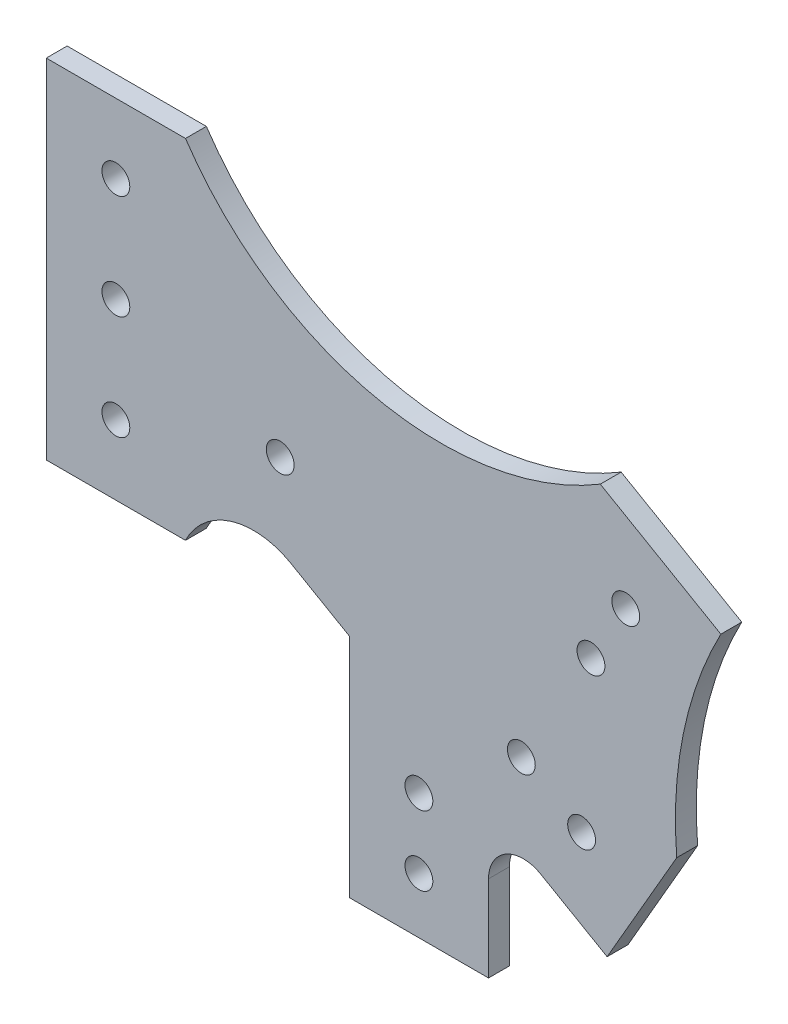
ISO-10303-21;
HEADER;
FILE_DESCRIPTION(('STEP AP214'),'2;1');
FILE_NAME('part.step','',(''),(''),'','','');
FILE_SCHEMA(('AUTOMOTIVE_DESIGN { 1 0 10303 214 1 1 1 1 }'));
ENDSEC;
DATA;
#1=APPLICATION_CONTEXT('core data for automotive mechanical design processes');
#2=APPLICATION_PROTOCOL_DEFINITION('international standard','automotive_design',2000,#1);
#3=PRODUCT_CONTEXT('',#1,'mechanical');
#4=PRODUCT('Part','Part','',(#3));
#5=PRODUCT_RELATED_PRODUCT_CATEGORY('part','',(#4));
#6=PRODUCT_DEFINITION_FORMATION('','',#4);
#7=PRODUCT_DEFINITION_CONTEXT('part definition',#1,'design');
#8=PRODUCT_DEFINITION('design','',#6,#7);
#9=PRODUCT_DEFINITION_SHAPE('','',#8);
#10=(LENGTH_UNIT() NAMED_UNIT(*) SI_UNIT(.MILLI.,.METRE.));
#11=(NAMED_UNIT(*) PLANE_ANGLE_UNIT() SI_UNIT($,.RADIAN.));
#12=(NAMED_UNIT(*) SI_UNIT($,.STERADIAN.) SOLID_ANGLE_UNIT());
#13=UNCERTAINTY_MEASURE_WITH_UNIT(LENGTH_MEASURE(1.E-05),#10,'distance_accuracy_value','');
#14=(GEOMETRIC_REPRESENTATION_CONTEXT(3) GLOBAL_UNCERTAINTY_ASSIGNED_CONTEXT((#13)) GLOBAL_UNIT_ASSIGNED_CONTEXT((#10,
#11,#12)) REPRESENTATION_CONTEXT('',''));
#15=CARTESIAN_POINT('',(0.,0.,0.));
#16=DIRECTION('',(0.,0.,1.));
#17=DIRECTION('',(1.,0.,0.));
#18=AXIS2_PLACEMENT_3D('',#15,#16,#17);
#19=CARTESIAN_POINT('',(97.8921935759024,-16.1788863713417,3.));
#20=DIRECTION('',(0.,0.,1.));
#21=DIRECTION('',(1.,0.,0.));
#22=AXIS2_PLACEMENT_3D('',#19,#20,#21);
#23=PLANE('',#22);
#24=CARTESIAN_POINT('',(4.60803954377895,-31.2923299826771,3.));
#25=DIRECTION('',(0.,0.,1.));
#26=DIRECTION('',(1.,0.,0.));
#27=AXIS2_PLACEMENT_3D('',#24,#25,#26);
#28=CIRCLE('',#27,1.99999999999997);
#29=CARTESIAN_POINT('',(6.60803954377892,-31.2923299826771,3.));
#30=VERTEX_POINT('',#29);
#31=EDGE_CURVE('E394',#30,#30,#28,.T.);
#32=ORIENTED_EDGE('',*,*,#31,.F.);
#33=EDGE_LOOP('',(#32));
#34=FACE_BOUND('',#33,.T.);
#35=CARTESIAN_POINT('',(19.3236286488305,-19.4678712380731,3.));
#36=DIRECTION('',(0.,0.,1.));
#37=DIRECTION('',(1.,0.,0.));
#38=AXIS2_PLACEMENT_3D('',#35,#36,#37);
#39=CIRCLE('',#38,2.);
#40=CARTESIAN_POINT('',(21.3236286488305,-19.4678712380731,3.));
#41=VERTEX_POINT('',#40);
#42=EDGE_CURVE('E410',#41,#41,#39,.T.);
#43=ORIENTED_EDGE('',*,*,#42,.F.);
#44=EDGE_LOOP('',(#43));
#45=FACE_BOUND('',#44,.T.);
#46=CARTESIAN_POINT('',(34.3236286488309,6.51289087545992,3.));
#47=DIRECTION('',(0.,0.,1.));
#48=DIRECTION('',(1.,0.,0.));
#49=AXIS2_PLACEMENT_3D('',#46,#47,#48);
#50=CIRCLE('',#49,2.);
#51=CARTESIAN_POINT('',(36.3236286488309,6.51289087545992,3.));
#52=VERTEX_POINT('',#51);
#53=EDGE_CURVE('E426',#52,#52,#50,.T.);
#54=ORIENTED_EDGE('',*,*,#53,.F.);
#55=EDGE_LOOP('',(#54));
#56=FACE_BOUND('',#55,.T.);
#57=CARTESIAN_POINT('',(-38.9219604562211,-6.61326738106016,3.));
#58=DIRECTION('',(0.,0.,1.));
#59=DIRECTION('',(1.,0.,0.));
#60=AXIS2_PLACEMENT_3D('',#57,#58,#59);
#61=CIRCLE('',#60,1.99999999999997);
#62=CARTESIAN_POINT('',(-36.9219604562211,-6.61326738106016,3.));
#63=VERTEX_POINT('',#62);
#64=EDGE_CURVE('E442',#63,#63,#61,.T.);
#65=ORIENTED_EDGE('',*,*,#64,.F.);
#66=EDGE_LOOP('',(#65));
#67=FACE_BOUND('',#66,.T.);
#68=CARTESIAN_POINT('',(-38.9219604562211,23.38673261894,3.));
#69=DIRECTION('',(0.,0.,1.));
#70=DIRECTION('',(1.,0.,0.));
#71=AXIS2_PLACEMENT_3D('',#68,#69,#70);
#72=CIRCLE('',#71,2.);
#73=CARTESIAN_POINT('',(-36.9219604562211,23.38673261894,3.));
#74=VERTEX_POINT('',#73);
#75=EDGE_CURVE('E188',#74,#74,#72,.T.);
#76=ORIENTED_EDGE('',*,*,#75,.F.);
#77=EDGE_LOOP('',(#76));
#78=FACE_BOUND('',#77,.T.);
#79=CARTESIAN_POINT('',(97.8921935759024,-16.1788863713417,3.));
#80=DIRECTION('',(0.,0.,-1.));
#81=DIRECTION('',(1.,0.,0.));
#82=AXIS2_PLACEMENT_3D('',#79,#80,#81);
#83=CIRCLE('',#82,56.4381878575378);
#84=CARTESIAN_POINT('',(41.6441367245194,-20.8076172002292,3.));
#85=VERTEX_POINT('',#84);
#86=CARTESIAN_POINT('',(47.9838826866749,10.1731449133043,3.));
#87=VERTEX_POINT('',#86);
#88=EDGE_CURVE('E224',#85,#87,#83,.T.);
#89=ORIENTED_EDGE('',*,*,#88,.T.);
#90=DIRECTION('',(-0.866025403784435,0.500000000000006,0.));
#91=VECTOR('',#90,1.);
#92=CARTESIAN_POINT('',(47.9838826866749,10.1731449133043,3.));
#93=LINE('',#92,#91);
#94=CARTESIAN_POINT('',(30.6633746109864,20.1731449133044,3.));
#95=VERTEX_POINT('',#94);
#96=EDGE_CURVE('E124',#87,#95,#93,.T.);
#97=ORIENTED_EDGE('',*,*,#96,.T.);
#98=CARTESIAN_POINT('',(7.80792740172895,58.0626309970088,3.));
#99=DIRECTION('',(0.,0.,-1.));
#100=DIRECTION('',(1.,0.,0.));
#101=AXIS2_PLACEMENT_3D('',#98,#99,#100);
#102=CIRCLE('',#101,44.2491200231414);
#103=CARTESIAN_POINT('',(-28.9219604562212,33.3867326189399,3.));
#104=VERTEX_POINT('',#103);
#105=EDGE_CURVE('E269',#95,#104,#102,.T.);
#106=ORIENTED_EDGE('',*,*,#105,.T.);
#107=DIRECTION('',(-1.,0.,0.));
#108=VECTOR('',#107,1.);
#109=CARTESIAN_POINT('',(-28.9219604562211,33.38673261894,3.));
#110=LINE('',#109,#108);
#111=CARTESIAN_POINT('',(-48.9219604562211,33.38673261894,3.));
#112=VERTEX_POINT('',#111);
#113=EDGE_CURVE('E289',#104,#112,#110,.T.);
#114=ORIENTED_EDGE('',*,*,#113,.T.);
#115=DIRECTION('',(0.,-1.,0.));
#116=VECTOR('',#115,1.);
#117=CARTESIAN_POINT('',(-48.9219604562211,33.38673261894,3.));
#118=LINE('',#117,#116);
#119=CARTESIAN_POINT('',(-48.9219604562211,-16.6132673810602,3.));
#120=VERTEX_POINT('',#119);
#121=EDGE_CURVE('E285',#112,#120,#118,.T.);
#122=ORIENTED_EDGE('',*,*,#121,.T.);
#123=DIRECTION('',(1.,0.,0.));
#124=VECTOR('',#123,1.);
#125=CARTESIAN_POINT('',(-48.9219604562211,-16.6132673810602,3.));
#126=LINE('',#125,#124);
#127=CARTESIAN_POINT('',(-28.9219604562211,-16.6132673810602,3.));
#128=VERTEX_POINT('',#127);
#129=EDGE_CURVE('E288',#120,#128,#126,.T.);
#130=ORIENTED_EDGE('',*,*,#129,.T.);
#131=CARTESIAN_POINT('',(-19.1502258272231,-21.3322462479486,3.));
#132=DIRECTION('',(0.,0.,-1.));
#133=DIRECTION('',(1.,0.,0.));
#134=AXIS2_PLACEMENT_3D('',#131,#132,#133);
#135=CIRCLE('',#134,10.8515233587594);
#136=CARTESIAN_POINT('',(-13.7244641478434,-11.9345513495027,3.));
#137=VERTEX_POINT('',#136);
#138=EDGE_CURVE('E293',#128,#137,#135,.T.);
#139=ORIENTED_EDGE('',*,*,#138,.T.);
#140=DIRECTION('',(0.86602540378442,-0.500000000000033,0.));
#141=VECTOR('',#140,1.);
#142=CARTESIAN_POINT('',(-13.7244641478433,-11.9345513495026,3.));
#143=LINE('',#142,#141);
#144=CARTESIAN_POINT('',(-5.39196045622106,-16.7453245988847,3.));
#145=VERTEX_POINT('',#144);
#146=EDGE_CURVE('E300',#137,#145,#143,.T.);
#147=ORIENTED_EDGE('',*,*,#146,.T.);
#148=DIRECTION('',(0.,-1.,0.));
#149=VECTOR('',#148,1.);
#150=CARTESIAN_POINT('',(-5.39196045622106,-16.7453245988847,3.));
#151=LINE('',#150,#149);
#152=CARTESIAN_POINT('',(-5.39196045622106,-49.2923299826771,3.));
#153=VERTEX_POINT('',#152);
#154=EDGE_CURVE('E303',#145,#153,#151,.T.);
#155=ORIENTED_EDGE('',*,*,#154,.T.);
#156=DIRECTION('',(1.,0.,0.));
#157=VECTOR('',#156,1.);
#158=CARTESIAN_POINT('',(-5.39196045622106,-49.2923299826771,3.));
#159=LINE('',#158,#157);
#160=CARTESIAN_POINT('',(14.6080395437789,-49.2923299826771,3.));
#161=VERTEX_POINT('',#160);
#162=EDGE_CURVE('E306',#153,#161,#159,.T.);
#163=ORIENTED_EDGE('',*,*,#162,.T.);
#164=DIRECTION('',(0.,1.,0.));
#165=VECTOR('',#164,1.);
#166=CARTESIAN_POINT('',(14.6080395437789,-49.2923299826771,3.));
#167=LINE('',#166,#165);
#168=CARTESIAN_POINT('',(14.6080395437789,-36.9525840205216,3.));
#169=VERTEX_POINT('',#168);
#170=EDGE_CURVE('E161',#161,#169,#167,.T.);
#171=ORIENTED_EDGE('',*,*,#170,.T.);
#172=CARTESIAN_POINT('',(19.6080395437789,-36.9525840205216,3.));
#173=DIRECTION('',(0.,0.,-1.));
#174=DIRECTION('',(1.,0.,0.));
#175=AXIS2_PLACEMENT_3D('',#172,#173,#174);
#176=CIRCLE('',#175,5.00000000000011);
#177=CARTESIAN_POINT('',(22.1080395437789,-32.6224570015993,3.));
#178=VERTEX_POINT('',#177);
#179=EDGE_CURVE('E155',#169,#178,#176,.T.);
#180=ORIENTED_EDGE('',*,*,#179,.T.);
#181=DIRECTION('',(0.866025403784448,-0.499999999999983,0.));
#182=VECTOR('',#181,1.);
#183=CARTESIAN_POINT('',(22.1080395437789,-32.6224570015992,3.));
#184=LINE('',#183,#182);
#185=CARTESIAN_POINT('',(31.6441367245189,-38.1281252759176,3.));
#186=VERTEX_POINT('',#185);
#187=EDGE_CURVE('E159',#178,#186,#184,.T.);
#188=ORIENTED_EDGE('',*,*,#187,.T.);
#189=DIRECTION('',(0.500000000000027,0.866025403784423,0.));
#190=VECTOR('',#189,1.);
#191=CARTESIAN_POINT('',(31.6441367245189,-38.1281252759176,3.));
#192=LINE('',#191,#190);
#193=EDGE_CURVE('E63',#186,#85,#192,.T.);
#194=ORIENTED_EDGE('',*,*,#193,.T.);
#195=EDGE_LOOP('',(#89,#97,#106,#114,#122,#130,#139,#147,#155,#163,#171,#180,#188,#194));
#196=FACE_BOUND('',#195,.T.);
#197=CARTESIAN_POINT('',(-38.9219604562211,8.38673261893985,3.));
#198=DIRECTION('',(0.,0.,1.));
#199=DIRECTION('',(1.,0.,0.));
#200=AXIS2_PLACEMENT_3D('',#197,#198,#199);
#201=CIRCLE('',#200,2.);
#202=CARTESIAN_POINT('',(-36.9219604562211,8.38673261893985,3.));
#203=VERTEX_POINT('',#202);
#204=EDGE_CURVE('E450',#203,#203,#201,.T.);
#205=ORIENTED_EDGE('',*,*,#204,.F.);
#206=EDGE_LOOP('',(#205));
#207=FACE_BOUND('',#206,.T.);
#208=CARTESIAN_POINT('',(-15.3173875025469,0.53212876192732,3.));
#209=DIRECTION('',(0.,0.,1.));
#210=DIRECTION('',(1.,0.,0.));
#211=AXIS2_PLACEMENT_3D('',#208,#209,#210);
#212=CIRCLE('',#211,2.);
#213=CARTESIAN_POINT('',(-13.3173875025469,0.53212876192732,3.));
#214=VERTEX_POINT('',#213);
#215=EDGE_CURVE('E434',#214,#214,#212,.T.);
#216=ORIENTED_EDGE('',*,*,#215,.F.);
#217=EDGE_LOOP('',(#216));
#218=FACE_BOUND('',#217,.T.);
#219=CARTESIAN_POINT('',(29.3236286488309,-2.14736316238462,3.));
#220=DIRECTION('',(0.,0.,1.));
#221=DIRECTION('',(1.,0.,0.));
#222=AXIS2_PLACEMENT_3D('',#219,#220,#221);
#223=CIRCLE('',#222,2.);
#224=CARTESIAN_POINT('',(31.3236286488309,-2.14736316238462,3.));
#225=VERTEX_POINT('',#224);
#226=EDGE_CURVE('E418',#225,#225,#223,.T.);
#227=ORIENTED_EDGE('',*,*,#226,.F.);
#228=EDGE_LOOP('',(#227));
#229=FACE_BOUND('',#228,.T.);
#230=CARTESIAN_POINT('',(27.9838826866749,-24.4678712380731,3.));
#231=DIRECTION('',(0.,0.,1.));
#232=DIRECTION('',(1.,0.,0.));
#233=AXIS2_PLACEMENT_3D('',#230,#231,#232);
#234=CIRCLE('',#233,1.99999999999997);
#235=CARTESIAN_POINT('',(29.9838826866749,-24.4678712380731,3.));
#236=VERTEX_POINT('',#235);
#237=EDGE_CURVE('E402',#236,#236,#234,.T.);
#238=ORIENTED_EDGE('',*,*,#237,.F.);
#239=EDGE_LOOP('',(#238));
#240=FACE_BOUND('',#239,.T.);
#241=CARTESIAN_POINT('',(4.60803954377895,-41.2923299826771,3.));
#242=DIRECTION('',(0.,0.,1.));
#243=DIRECTION('',(1.,0.,0.));
#244=AXIS2_PLACEMENT_3D('',#241,#242,#243);
#245=CIRCLE('',#244,2.);
#246=CARTESIAN_POINT('',(6.60803954377894,-41.2923299826771,3.));
#247=VERTEX_POINT('',#246);
#248=EDGE_CURVE('E383',#247,#247,#245,.T.);
#249=ORIENTED_EDGE('',*,*,#248,.F.);
#250=EDGE_LOOP('',(#249));
#251=FACE_BOUND('',#250,.T.);
#252=ADVANCED_FACE('F45',(#34,#45,#56,#67,#78,#196,#207,#218,#229,#240,#251),#23,.T.);
#253=CARTESIAN_POINT('',(97.8921935759024,-16.1788863713417,0.));
#254=DIRECTION('',(0.,0.,1.));
#255=DIRECTION('',(1.,0.,0.));
#256=AXIS2_PLACEMENT_3D('',#253,#254,#255);
#257=PLANE('',#256);
#258=CARTESIAN_POINT('',(97.8921935759024,-16.1788863713417,0.));
#259=DIRECTION('',(0.,0.,-1.));
#260=DIRECTION('',(1.,0.,0.));
#261=AXIS2_PLACEMENT_3D('',#258,#259,#260);
#262=CIRCLE('',#261,56.4381878575378);
#263=CARTESIAN_POINT('',(41.6441367245194,-20.8076172002292,0.));
#264=VERTEX_POINT('',#263);
#265=CARTESIAN_POINT('',(47.9838826866749,10.1731449133043,0.));
#266=VERTEX_POINT('',#265);
#267=EDGE_CURVE('E183',#264,#266,#262,.T.);
#268=ORIENTED_EDGE('',*,*,#267,.F.);
#269=DIRECTION('',(0.500000000000027,0.866025403784423,0.));
#270=VECTOR('',#269,1.);
#271=CARTESIAN_POINT('',(31.6441367245189,-38.1281252759176,0.));
#272=LINE('',#271,#270);
#273=CARTESIAN_POINT('',(31.6441367245189,-38.1281252759176,0.));
#274=VERTEX_POINT('',#273);
#275=EDGE_CURVE('E116',#274,#264,#272,.T.);
#276=ORIENTED_EDGE('',*,*,#275,.F.);
#277=DIRECTION('',(0.866025403784448,-0.499999999999983,0.));
#278=VECTOR('',#277,1.);
#279=CARTESIAN_POINT('',(22.1080395437789,-32.6224570015992,0.));
#280=LINE('',#279,#278);
#281=CARTESIAN_POINT('',(22.1080395437789,-32.6224570015993,0.));
#282=VERTEX_POINT('',#281);
#283=EDGE_CURVE('E110',#282,#274,#280,.T.);
#284=ORIENTED_EDGE('',*,*,#283,.F.);
#285=CARTESIAN_POINT('',(19.6080395437789,-36.9525840205216,0.));
#286=DIRECTION('',(0.,0.,-1.));
#287=DIRECTION('',(1.,0.,0.));
#288=AXIS2_PLACEMENT_3D('',#285,#286,#287);
#289=CIRCLE('',#288,5.00000000000011);
#290=CARTESIAN_POINT('',(14.6080395437789,-36.9525840205216,0.));
#291=VERTEX_POINT('',#290);
#292=EDGE_CURVE('E170',#291,#282,#289,.T.);
#293=ORIENTED_EDGE('',*,*,#292,.F.);
#294=DIRECTION('',(0.,1.,0.));
#295=VECTOR('',#294,1.);
#296=CARTESIAN_POINT('',(14.6080395437789,-49.2923299826771,0.));
#297=LINE('',#296,#295);
#298=CARTESIAN_POINT('',(14.6080395437789,-49.2923299826771,0.));
#299=VERTEX_POINT('',#298);
#300=EDGE_CURVE('E215',#299,#291,#297,.T.);
#301=ORIENTED_EDGE('',*,*,#300,.F.);
#302=DIRECTION('',(1.,0.,0.));
#303=VECTOR('',#302,1.);
#304=CARTESIAN_POINT('',(-5.39196045622106,-49.2923299826771,0.));
#305=LINE('',#304,#303);
#306=CARTESIAN_POINT('',(-5.39196045622106,-49.2923299826771,0.));
#307=VERTEX_POINT('',#306);
#308=EDGE_CURVE('E212',#307,#299,#305,.T.);
#309=ORIENTED_EDGE('',*,*,#308,.F.);
#310=DIRECTION('',(0.,-1.,0.));
#311=VECTOR('',#310,1.);
#312=CARTESIAN_POINT('',(-5.39196045622106,-16.7453245988847,0.));
#313=LINE('',#312,#311);
#314=CARTESIAN_POINT('',(-5.39196045622106,-16.7453245988847,0.));
#315=VERTEX_POINT('',#314);
#316=EDGE_CURVE('E209',#315,#307,#313,.T.);
#317=ORIENTED_EDGE('',*,*,#316,.F.);
#318=DIRECTION('',(0.86602540378442,-0.500000000000033,0.));
#319=VECTOR('',#318,1.);
#320=CARTESIAN_POINT('',(-13.7244641478433,-11.9345513495026,0.));
#321=LINE('',#320,#319);
#322=CARTESIAN_POINT('',(-13.7244641478434,-11.9345513495027,0.));
#323=VERTEX_POINT('',#322);
#324=EDGE_CURVE('E206',#323,#315,#321,.T.);
#325=ORIENTED_EDGE('',*,*,#324,.F.);
#326=CARTESIAN_POINT('',(-19.1502258272231,-21.3322462479486,0.));
#327=DIRECTION('',(0.,0.,-1.));
#328=DIRECTION('',(1.,0.,0.));
#329=AXIS2_PLACEMENT_3D('',#326,#327,#328);
#330=CIRCLE('',#329,10.8515233587594);
#331=CARTESIAN_POINT('',(-28.9219604562211,-16.6132673810602,0.));
#332=VERTEX_POINT('',#331);
#333=EDGE_CURVE('E203',#332,#323,#330,.T.);
#334=ORIENTED_EDGE('',*,*,#333,.F.);
#335=DIRECTION('',(1.,0.,0.));
#336=VECTOR('',#335,1.);
#337=CARTESIAN_POINT('',(-48.9219604562211,-16.6132673810602,0.));
#338=LINE('',#337,#336);
#339=CARTESIAN_POINT('',(-48.9219604562211,-16.6132673810602,0.));
#340=VERTEX_POINT('',#339);
#341=EDGE_CURVE('E200',#340,#332,#338,.T.);
#342=ORIENTED_EDGE('',*,*,#341,.F.);
#343=DIRECTION('',(0.,-1.,0.));
#344=VECTOR('',#343,1.);
#345=CARTESIAN_POINT('',(-48.9219604562211,33.38673261894,0.));
#346=LINE('',#345,#344);
#347=CARTESIAN_POINT('',(-48.9219604562211,33.38673261894,0.));
#348=VERTEX_POINT('',#347);
#349=EDGE_CURVE('E197',#348,#340,#346,.T.);
#350=ORIENTED_EDGE('',*,*,#349,.F.);
#351=DIRECTION('',(-1.,0.,0.));
#352=VECTOR('',#351,1.);
#353=CARTESIAN_POINT('',(-28.9219604562211,33.38673261894,0.));
#354=LINE('',#353,#352);
#355=CARTESIAN_POINT('',(-28.9219604562212,33.3867326189399,0.));
#356=VERTEX_POINT('',#355);
#357=EDGE_CURVE('E194',#356,#348,#354,.T.);
#358=ORIENTED_EDGE('',*,*,#357,.F.);
#359=CARTESIAN_POINT('',(7.80792740172895,58.0626309970088,0.));
#360=DIRECTION('',(0.,0.,-1.));
#361=DIRECTION('',(1.,0.,0.));
#362=AXIS2_PLACEMENT_3D('',#359,#360,#361);
#363=CIRCLE('',#362,44.2491200231414);
#364=CARTESIAN_POINT('',(30.6633746109864,20.1731449133044,0.));
#365=VERTEX_POINT('',#364);
#366=EDGE_CURVE('E191',#365,#356,#363,.T.);
#367=ORIENTED_EDGE('',*,*,#366,.F.);
#368=DIRECTION('',(-0.866025403784435,0.500000000000006,0.));
#369=VECTOR('',#368,1.);
#370=CARTESIAN_POINT('',(47.9838826866749,10.1731449133043,0.));
#371=LINE('',#370,#369);
#372=EDGE_CURVE('E187',#266,#365,#371,.T.);
#373=ORIENTED_EDGE('',*,*,#372,.F.);
#374=EDGE_LOOP('',(#268,#276,#284,#293,#301,#309,#317,#325,#334,#342,#350,#358,#367,#373));
#375=FACE_BOUND('',#374,.T.);
#376=CARTESIAN_POINT('',(-38.9219604562211,23.38673261894,0.));
#377=DIRECTION('',(0.,0.,1.));
#378=DIRECTION('',(1.,0.,0.));
#379=AXIS2_PLACEMENT_3D('',#376,#377,#378);
#380=CIRCLE('',#379,2.);
#381=CARTESIAN_POINT('',(-36.9219604562211,23.38673261894,0.));
#382=VERTEX_POINT('',#381);
#383=EDGE_CURVE('E454',#382,#382,#380,.T.);
#384=ORIENTED_EDGE('',*,*,#383,.T.);
#385=EDGE_LOOP('',(#384));
#386=FACE_BOUND('',#385,.T.);
#387=CARTESIAN_POINT('',(-38.9219604562211,8.38673261893985,0.));
#388=DIRECTION('',(0.,0.,1.));
#389=DIRECTION('',(1.,0.,0.));
#390=AXIS2_PLACEMENT_3D('',#387,#388,#389);
#391=CIRCLE('',#390,2.);
#392=CARTESIAN_POINT('',(-36.9219604562211,8.38673261893985,0.));
#393=VERTEX_POINT('',#392);
#394=EDGE_CURVE('E446',#393,#393,#391,.T.);
#395=ORIENTED_EDGE('',*,*,#394,.T.);
#396=EDGE_LOOP('',(#395));
#397=FACE_BOUND('',#396,.T.);
#398=CARTESIAN_POINT('',(-38.9219604562211,-6.61326738106016,0.));
#399=DIRECTION('',(0.,0.,1.));
#400=DIRECTION('',(1.,0.,0.));
#401=AXIS2_PLACEMENT_3D('',#398,#399,#400);
#402=CIRCLE('',#401,1.99999999999997);
#403=CARTESIAN_POINT('',(-36.9219604562211,-6.61326738106016,0.));
#404=VERTEX_POINT('',#403);
#405=EDGE_CURVE('E438',#404,#404,#402,.T.);
#406=ORIENTED_EDGE('',*,*,#405,.T.);
#407=EDGE_LOOP('',(#406));
#408=FACE_BOUND('',#407,.T.);
#409=CARTESIAN_POINT('',(-15.3173875025469,0.53212876192732,0.));
#410=DIRECTION('',(0.,0.,1.));
#411=DIRECTION('',(1.,0.,0.));
#412=AXIS2_PLACEMENT_3D('',#409,#410,#411);
#413=CIRCLE('',#412,2.);
#414=CARTESIAN_POINT('',(-13.3173875025469,0.53212876192732,0.));
#415=VERTEX_POINT('',#414);
#416=EDGE_CURVE('E430',#415,#415,#413,.T.);
#417=ORIENTED_EDGE('',*,*,#416,.T.);
#418=EDGE_LOOP('',(#417));
#419=FACE_BOUND('',#418,.T.);
#420=CARTESIAN_POINT('',(34.3236286488309,6.51289087545992,0.));
#421=DIRECTION('',(0.,0.,1.));
#422=DIRECTION('',(1.,0.,0.));
#423=AXIS2_PLACEMENT_3D('',#420,#421,#422);
#424=CIRCLE('',#423,2.);
#425=CARTESIAN_POINT('',(36.3236286488309,6.51289087545992,0.));
#426=VERTEX_POINT('',#425);
#427=EDGE_CURVE('E422',#426,#426,#424,.T.);
#428=ORIENTED_EDGE('',*,*,#427,.T.);
#429=EDGE_LOOP('',(#428));
#430=FACE_BOUND('',#429,.T.);
#431=CARTESIAN_POINT('',(29.3236286488309,-2.14736316238462,0.));
#432=DIRECTION('',(0.,0.,1.));
#433=DIRECTION('',(1.,0.,0.));
#434=AXIS2_PLACEMENT_3D('',#431,#432,#433);
#435=CIRCLE('',#434,2.);
#436=CARTESIAN_POINT('',(31.3236286488309,-2.14736316238462,0.));
#437=VERTEX_POINT('',#436);
#438=EDGE_CURVE('E414',#437,#437,#435,.T.);
#439=ORIENTED_EDGE('',*,*,#438,.T.);
#440=EDGE_LOOP('',(#439));
#441=FACE_BOUND('',#440,.T.);
#442=CARTESIAN_POINT('',(19.3236286488305,-19.4678712380731,0.));
#443=DIRECTION('',(0.,0.,1.));
#444=DIRECTION('',(1.,0.,0.));
#445=AXIS2_PLACEMENT_3D('',#442,#443,#444);
#446=CIRCLE('',#445,2.);
#447=CARTESIAN_POINT('',(21.3236286488305,-19.4678712380731,0.));
#448=VERTEX_POINT('',#447);
#449=EDGE_CURVE('E406',#448,#448,#446,.T.);
#450=ORIENTED_EDGE('',*,*,#449,.T.);
#451=EDGE_LOOP('',(#450));
#452=FACE_BOUND('',#451,.T.);
#453=CARTESIAN_POINT('',(27.9838826866749,-24.4678712380731,0.));
#454=DIRECTION('',(0.,0.,1.));
#455=DIRECTION('',(1.,0.,0.));
#456=AXIS2_PLACEMENT_3D('',#453,#454,#455);
#457=CIRCLE('',#456,1.99999999999997);
#458=CARTESIAN_POINT('',(29.9838826866749,-24.4678712380731,0.));
#459=VERTEX_POINT('',#458);
#460=EDGE_CURVE('E398',#459,#459,#457,.T.);
#461=ORIENTED_EDGE('',*,*,#460,.T.);
#462=EDGE_LOOP('',(#461));
#463=FACE_BOUND('',#462,.T.);
#464=CARTESIAN_POINT('',(4.60803954377895,-31.2923299826771,0.));
#465=DIRECTION('',(0.,0.,1.));
#466=DIRECTION('',(1.,0.,0.));
#467=AXIS2_PLACEMENT_3D('',#464,#465,#466);
#468=CIRCLE('',#467,1.99999999999997);
#469=CARTESIAN_POINT('',(6.60803954377892,-31.2923299826771,0.));
#470=VERTEX_POINT('',#469);
#471=EDGE_CURVE('E391',#470,#470,#468,.T.);
#472=ORIENTED_EDGE('',*,*,#471,.T.);
#473=EDGE_LOOP('',(#472));
#474=FACE_BOUND('',#473,.T.);
#475=CARTESIAN_POINT('',(4.60803954377895,-41.2923299826771,0.));
#476=DIRECTION('',(0.,0.,1.));
#477=DIRECTION('',(1.,0.,0.));
#478=AXIS2_PLACEMENT_3D('',#475,#476,#477);
#479=CIRCLE('',#478,2.);
#480=CARTESIAN_POINT('',(6.60803954377894,-41.2923299826771,0.));
#481=VERTEX_POINT('',#480);
#482=EDGE_CURVE('E386',#481,#481,#479,.T.);
#483=ORIENTED_EDGE('',*,*,#482,.T.);
#484=EDGE_LOOP('',(#483));
#485=FACE_BOUND('',#484,.T.);
#486=ADVANCED_FACE('F273',(#375,#386,#397,#408,#419,#430,#441,#452,#463,#474,#485),#257,.F.);
#487=CARTESIAN_POINT('',(97.8921935759024,-16.1788863713417,3.));
#488=DIRECTION('',(0.,0.,-1.));
#489=DIRECTION('',(-1.,0.,0.));
#490=AXIS2_PLACEMENT_3D('',#487,#488,#489);
#491=CYLINDRICAL_SURFACE('',#490,56.4381878575378);
#492=ORIENTED_EDGE('',*,*,#267,.T.);
#493=DIRECTION('',(0.,0.,-1.));
#494=VECTOR('',#493,1.);
#495=CARTESIAN_POINT('',(47.9838826866749,10.1731449133043,3.));
#496=LINE('',#495,#494);
#497=EDGE_CURVE('E11',#87,#266,#496,.T.);
#498=ORIENTED_EDGE('',*,*,#497,.F.);
#499=ORIENTED_EDGE('',*,*,#88,.F.);
#500=DIRECTION('',(0.,0.,-1.));
#501=VECTOR('',#500,1.);
#502=CARTESIAN_POINT('',(41.6441367245194,-20.8076172002292,3.));
#503=LINE('',#502,#501);
#504=EDGE_CURVE('E179',#85,#264,#503,.T.);
#505=ORIENTED_EDGE('',*,*,#504,.T.);
#506=EDGE_LOOP('',(#492,#498,#499,#505));
#507=FACE_BOUND('',#506,.T.);
#508=ADVANCED_FACE('F47',(#507),#491,.F.);
#509=CARTESIAN_POINT('',(47.9838826866749,10.1731449133043,3.));
#510=DIRECTION('',(-0.500000000000006,-0.866025403784435,0.));
#511=DIRECTION('',(0.866025403784435,-0.500000000000006,0.));
#512=AXIS2_PLACEMENT_3D('',#509,#510,#511);
#513=PLANE('',#512);
#514=ORIENTED_EDGE('',*,*,#372,.T.);
#515=DIRECTION('',(0.,0.,-1.));
#516=VECTOR('',#515,1.);
#517=CARTESIAN_POINT('',(30.6633746109864,20.1731449133044,3.));
#518=LINE('',#517,#516);
#519=EDGE_CURVE('E55',#95,#365,#518,.T.);
#520=ORIENTED_EDGE('',*,*,#519,.F.);
#521=ORIENTED_EDGE('',*,*,#96,.F.);
#522=ORIENTED_EDGE('',*,*,#497,.T.);
#523=EDGE_LOOP('',(#514,#520,#521,#522));
#524=FACE_BOUND('',#523,.T.);
#525=ADVANCED_FACE('F654',(#524),#513,.F.);
#526=CARTESIAN_POINT('',(7.80792740172895,58.0626309970088,3.));
#527=DIRECTION('',(0.,0.,-1.));
#528=DIRECTION('',(-1.,0.,0.));
#529=AXIS2_PLACEMENT_3D('',#526,#527,#528);
#530=CYLINDRICAL_SURFACE('',#529,44.2491200231414);
#531=ORIENTED_EDGE('',*,*,#366,.T.);
#532=DIRECTION('',(0.,0.,-1.));
#533=VECTOR('',#532,1.);
#534=CARTESIAN_POINT('',(-28.9219604562212,33.3867326189399,3.));
#535=LINE('',#534,#533);
#536=EDGE_CURVE('E259',#104,#356,#535,.T.);
#537=ORIENTED_EDGE('',*,*,#536,.F.);
#538=ORIENTED_EDGE('',*,*,#105,.F.);
#539=ORIENTED_EDGE('',*,*,#519,.T.);
#540=EDGE_LOOP('',(#531,#537,#538,#539));
#541=FACE_BOUND('',#540,.T.);
#542=ADVANCED_FACE('F267',(#541),#530,.F.);
#543=CARTESIAN_POINT('',(-28.9219604562211,33.38673261894,3.));
#544=DIRECTION('',(0.,-1.,0.));
#545=DIRECTION('',(0.,0.,-1.));
#546=AXIS2_PLACEMENT_3D('',#543,#544,#545);
#547=PLANE('',#546);
#548=ORIENTED_EDGE('',*,*,#357,.T.);
#549=DIRECTION('',(0.,0.,-1.));
#550=VECTOR('',#549,1.);
#551=CARTESIAN_POINT('',(-48.9219604562211,33.38673261894,3.));
#552=LINE('',#551,#550);
#553=EDGE_CURVE('E255',#112,#348,#552,.T.);
#554=ORIENTED_EDGE('',*,*,#553,.F.);
#555=ORIENTED_EDGE('',*,*,#113,.F.);
#556=ORIENTED_EDGE('',*,*,#536,.T.);
#557=EDGE_LOOP('',(#548,#554,#555,#556));
#558=FACE_BOUND('',#557,.T.);
#559=ADVANCED_FACE('F279',(#558),#547,.F.);
#560=CARTESIAN_POINT('',(-48.9219604562211,33.38673261894,3.));
#561=DIRECTION('',(1.,0.,0.));
#562=DIRECTION('',(0.,0.,-1.));
#563=AXIS2_PLACEMENT_3D('',#560,#561,#562);
#564=PLANE('',#563);
#565=ORIENTED_EDGE('',*,*,#349,.T.);
#566=DIRECTION('',(0.,0.,-1.));
#567=VECTOR('',#566,1.);
#568=CARTESIAN_POINT('',(-48.9219604562211,-16.6132673810602,3.));
#569=LINE('',#568,#567);
#570=EDGE_CURVE('E251',#120,#340,#569,.T.);
#571=ORIENTED_EDGE('',*,*,#570,.F.);
#572=ORIENTED_EDGE('',*,*,#121,.F.);
#573=ORIENTED_EDGE('',*,*,#553,.T.);
#574=EDGE_LOOP('',(#565,#571,#572,#573));
#575=FACE_BOUND('',#574,.T.);
#576=ADVANCED_FACE('F283',(#575),#564,.F.);
#577=CARTESIAN_POINT('',(-48.9219604562211,-16.6132673810602,3.));
#578=DIRECTION('',(0.,1.,0.));
#579=DIRECTION('',(0.,0.,1.));
#580=AXIS2_PLACEMENT_3D('',#577,#578,#579);
#581=PLANE('',#580);
#582=ORIENTED_EDGE('',*,*,#341,.T.);
#583=DIRECTION('',(0.,0.,-1.));
#584=VECTOR('',#583,1.);
#585=CARTESIAN_POINT('',(-28.9219604562211,-16.6132673810602,3.));
#586=LINE('',#585,#584);
#587=EDGE_CURVE('E247',#128,#332,#586,.T.);
#588=ORIENTED_EDGE('',*,*,#587,.F.);
#589=ORIENTED_EDGE('',*,*,#129,.F.);
#590=ORIENTED_EDGE('',*,*,#570,.T.);
#591=EDGE_LOOP('',(#582,#588,#589,#590));
#592=FACE_BOUND('',#591,.T.);
#593=ADVANCED_FACE('F619',(#592),#581,.F.);
#594=CARTESIAN_POINT('',(-19.1502258272231,-21.3322462479486,3.));
#595=DIRECTION('',(0.,0.,-1.));
#596=DIRECTION('',(-1.,0.,0.));
#597=AXIS2_PLACEMENT_3D('',#594,#595,#596);
#598=CYLINDRICAL_SURFACE('',#597,10.8515233587594);
#599=ORIENTED_EDGE('',*,*,#333,.T.);
#600=DIRECTION('',(0.,0.,-1.));
#601=VECTOR('',#600,1.);
#602=CARTESIAN_POINT('',(-13.7244641478434,-11.9345513495027,3.));
#603=LINE('',#602,#601);
#604=EDGE_CURVE('E243',#137,#323,#603,.T.);
#605=ORIENTED_EDGE('',*,*,#604,.F.);
#606=ORIENTED_EDGE('',*,*,#138,.F.);
#607=ORIENTED_EDGE('',*,*,#587,.T.);
#608=EDGE_LOOP('',(#599,#605,#606,#607));
#609=FACE_BOUND('',#608,.T.);
#610=ADVANCED_FACE('F609',(#609),#598,.F.);
#611=CARTESIAN_POINT('',(-13.7244641478433,-11.9345513495026,3.));
#612=DIRECTION('',(0.500000000000033,0.86602540378442,0.));
#613=DIRECTION('',(-0.86602540378442,0.500000000000033,0.));
#614=AXIS2_PLACEMENT_3D('',#611,#612,#613);
#615=PLANE('',#614);
#616=ORIENTED_EDGE('',*,*,#324,.T.);
#617=DIRECTION('',(0.,0.,-1.));
#618=VECTOR('',#617,1.);
#619=CARTESIAN_POINT('',(-5.39196045622106,-16.7453245988847,3.));
#620=LINE('',#619,#618);
#621=EDGE_CURVE('E239',#145,#315,#620,.T.);
#622=ORIENTED_EDGE('',*,*,#621,.F.);
#623=ORIENTED_EDGE('',*,*,#146,.F.);
#624=ORIENTED_EDGE('',*,*,#604,.T.);
#625=EDGE_LOOP('',(#616,#622,#623,#624));
#626=FACE_BOUND('',#625,.T.);
#627=ADVANCED_FACE('F599',(#626),#615,.F.);
#628=CARTESIAN_POINT('',(-5.39196045622106,-16.7453245988847,3.));
#629=DIRECTION('',(1.,0.,0.));
#630=DIRECTION('',(0.,0.,-1.));
#631=AXIS2_PLACEMENT_3D('',#628,#629,#630);
#632=PLANE('',#631);
#633=ORIENTED_EDGE('',*,*,#316,.T.);
#634=DIRECTION('',(0.,0.,-1.));
#635=VECTOR('',#634,1.);
#636=CARTESIAN_POINT('',(-5.39196045622106,-49.2923299826771,3.));
#637=LINE('',#636,#635);
#638=EDGE_CURVE('E235',#153,#307,#637,.T.);
#639=ORIENTED_EDGE('',*,*,#638,.F.);
#640=ORIENTED_EDGE('',*,*,#154,.F.);
#641=ORIENTED_EDGE('',*,*,#621,.T.);
#642=EDGE_LOOP('',(#633,#639,#640,#641));
#643=FACE_BOUND('',#642,.T.);
#644=ADVANCED_FACE('F590',(#643),#632,.F.);
#645=CARTESIAN_POINT('',(-5.39196045622106,-49.2923299826771,3.));
#646=DIRECTION('',(0.,1.,0.));
#647=DIRECTION('',(0.,0.,1.));
#648=AXIS2_PLACEMENT_3D('',#645,#646,#647);
#649=PLANE('',#648);
#650=ORIENTED_EDGE('',*,*,#308,.T.);
#651=DIRECTION('',(0.,0.,-1.));
#652=VECTOR('',#651,1.);
#653=CARTESIAN_POINT('',(14.6080395437789,-49.2923299826771,3.));
#654=LINE('',#653,#652);
#655=EDGE_CURVE('E231',#161,#299,#654,.T.);
#656=ORIENTED_EDGE('',*,*,#655,.F.);
#657=ORIENTED_EDGE('',*,*,#162,.F.);
#658=ORIENTED_EDGE('',*,*,#638,.T.);
#659=EDGE_LOOP('',(#650,#656,#657,#658));
#660=FACE_BOUND('',#659,.T.);
#661=ADVANCED_FACE('F314',(#660),#649,.F.);
#662=CARTESIAN_POINT('',(14.6080395437789,-49.2923299826771,3.));
#663=DIRECTION('',(-1.,0.,0.));
#664=DIRECTION('',(0.,0.,1.));
#665=AXIS2_PLACEMENT_3D('',#662,#663,#664);
#666=PLANE('',#665);
#667=ORIENTED_EDGE('',*,*,#300,.T.);
#668=DIRECTION('',(0.,0.,-1.));
#669=VECTOR('',#668,1.);
#670=CARTESIAN_POINT('',(14.6080395437789,-36.9525840205216,3.));
#671=LINE('',#670,#669);
#672=EDGE_CURVE('E172',#169,#291,#671,.T.);
#673=ORIENTED_EDGE('',*,*,#672,.F.);
#674=ORIENTED_EDGE('',*,*,#170,.F.);
#675=ORIENTED_EDGE('',*,*,#655,.T.);
#676=EDGE_LOOP('',(#667,#673,#674,#675));
#677=FACE_BOUND('',#676,.T.);
#678=ADVANCED_FACE('F318',(#677),#666,.F.);
#679=CARTESIAN_POINT('',(19.6080395437789,-36.9525840205216,3.));
#680=DIRECTION('',(0.,0.,-1.));
#681=DIRECTION('',(-1.,0.,0.));
#682=AXIS2_PLACEMENT_3D('',#679,#680,#681);
#683=CYLINDRICAL_SURFACE('',#682,5.00000000000011);
#684=ORIENTED_EDGE('',*,*,#292,.T.);
#685=DIRECTION('',(0.,0.,-1.));
#686=VECTOR('',#685,1.);
#687=CARTESIAN_POINT('',(22.1080395437789,-32.6224570015993,3.));
#688=LINE('',#687,#686);
#689=EDGE_CURVE('E167',#178,#282,#688,.T.);
#690=ORIENTED_EDGE('',*,*,#689,.F.);
#691=ORIENTED_EDGE('',*,*,#179,.F.);
#692=ORIENTED_EDGE('',*,*,#672,.T.);
#693=EDGE_LOOP('',(#684,#690,#691,#692));
#694=FACE_BOUND('',#693,.T.);
#695=ADVANCED_FACE('F168',(#694),#683,.F.);
#696=CARTESIAN_POINT('',(22.1080395437789,-32.6224570015992,3.));
#697=DIRECTION('',(0.499999999999983,0.866025403784448,0.));
#698=DIRECTION('',(-0.866025403784449,0.499999999999983,0.));
#699=AXIS2_PLACEMENT_3D('',#696,#697,#698);
#700=PLANE('',#699);
#701=ORIENTED_EDGE('',*,*,#283,.T.);
#702=DIRECTION('',(0.,0.,-1.));
#703=VECTOR('',#702,1.);
#704=CARTESIAN_POINT('',(31.6441367245189,-38.1281252759176,3.));
#705=LINE('',#704,#703);
#706=EDGE_CURVE('E173',#186,#274,#705,.T.);
#707=ORIENTED_EDGE('',*,*,#706,.F.);
#708=ORIENTED_EDGE('',*,*,#187,.F.);
#709=ORIENTED_EDGE('',*,*,#689,.T.);
#710=EDGE_LOOP('',(#701,#707,#708,#709));
#711=FACE_BOUND('',#710,.T.);
#712=ADVANCED_FACE('F175',(#711),#700,.F.);
#713=CARTESIAN_POINT('',(31.6441367245189,-38.1281252759176,3.));
#714=DIRECTION('',(-0.866025403784423,0.500000000000027,0.));
#715=DIRECTION('',(-0.500000000000027,-0.866025403784423,0.));
#716=AXIS2_PLACEMENT_3D('',#713,#714,#715);
#717=PLANE('',#716);
#718=ORIENTED_EDGE('',*,*,#275,.T.);
#719=ORIENTED_EDGE('',*,*,#504,.F.);
#720=ORIENTED_EDGE('',*,*,#193,.F.);
#721=ORIENTED_EDGE('',*,*,#706,.T.);
#722=EDGE_LOOP('',(#718,#719,#720,#721));
#723=FACE_BOUND('',#722,.T.);
#724=ADVANCED_FACE('F322',(#723),#717,.F.);
#725=CARTESIAN_POINT('',(-38.9219604562211,23.38673261894,3.));
#726=DIRECTION('',(0.,0.,-1.));
#727=DIRECTION('',(-1.,0.,0.));
#728=AXIS2_PLACEMENT_3D('',#725,#726,#727);
#729=CYLINDRICAL_SURFACE('',#728,2.);
#730=ORIENTED_EDGE('',*,*,#75,.T.);
#731=EDGE_LOOP('',(#730));
#732=FACE_BOUND('',#731,.T.);
#733=ORIENTED_EDGE('',*,*,#383,.F.);
#734=EDGE_LOOP('',(#733));
#735=FACE_BOUND('',#734,.T.);
#736=ADVANCED_FACE('F324',(#732,#735),#729,.F.);
#737=CARTESIAN_POINT('',(-38.9219604562211,8.38673261893985,3.));
#738=DIRECTION('',(0.,0.,-1.));
#739=DIRECTION('',(-1.,0.,0.));
#740=AXIS2_PLACEMENT_3D('',#737,#738,#739);
#741=CYLINDRICAL_SURFACE('',#740,2.);
#742=ORIENTED_EDGE('',*,*,#204,.T.);
#743=EDGE_LOOP('',(#742));
#744=FACE_BOUND('',#743,.T.);
#745=ORIENTED_EDGE('',*,*,#394,.F.);
#746=EDGE_LOOP('',(#745));
#747=FACE_BOUND('',#746,.T.);
#748=ADVANCED_FACE('F330',(#744,#747),#741,.F.);
#749=CARTESIAN_POINT('',(-38.9219604562211,-6.61326738106016,3.));
#750=DIRECTION('',(0.,0.,-1.));
#751=DIRECTION('',(-1.,0.,0.));
#752=AXIS2_PLACEMENT_3D('',#749,#750,#751);
#753=CYLINDRICAL_SURFACE('',#752,1.99999999999997);
#754=ORIENTED_EDGE('',*,*,#64,.T.);
#755=EDGE_LOOP('',(#754));
#756=FACE_BOUND('',#755,.T.);
#757=ORIENTED_EDGE('',*,*,#405,.F.);
#758=EDGE_LOOP('',(#757));
#759=FACE_BOUND('',#758,.T.);
#760=ADVANCED_FACE('F346',(#756,#759),#753,.F.);
#761=CARTESIAN_POINT('',(-15.3173875025469,0.53212876192732,3.));
#762=DIRECTION('',(0.,0.,-1.));
#763=DIRECTION('',(-1.,0.,0.));
#764=AXIS2_PLACEMENT_3D('',#761,#762,#763);
#765=CYLINDRICAL_SURFACE('',#764,2.);
#766=ORIENTED_EDGE('',*,*,#215,.T.);
#767=EDGE_LOOP('',(#766));
#768=FACE_BOUND('',#767,.T.);
#769=ORIENTED_EDGE('',*,*,#416,.F.);
#770=EDGE_LOOP('',(#769));
#771=FACE_BOUND('',#770,.T.);
#772=ADVANCED_FACE('F350',(#768,#771),#765,.F.);
#773=CARTESIAN_POINT('',(34.3236286488309,6.51289087545992,3.));
#774=DIRECTION('',(0.,0.,-1.));
#775=DIRECTION('',(-1.,0.,0.));
#776=AXIS2_PLACEMENT_3D('',#773,#774,#775);
#777=CYLINDRICAL_SURFACE('',#776,2.);
#778=ORIENTED_EDGE('',*,*,#53,.T.);
#779=EDGE_LOOP('',(#778));
#780=FACE_BOUND('',#779,.T.);
#781=ORIENTED_EDGE('',*,*,#427,.F.);
#782=EDGE_LOOP('',(#781));
#783=FACE_BOUND('',#782,.T.);
#784=ADVANCED_FACE('F354',(#780,#783),#777,.F.);
#785=CARTESIAN_POINT('',(29.3236286488309,-2.14736316238462,3.));
#786=DIRECTION('',(0.,0.,-1.));
#787=DIRECTION('',(-1.,0.,0.));
#788=AXIS2_PLACEMENT_3D('',#785,#786,#787);
#789=CYLINDRICAL_SURFACE('',#788,2.);
#790=ORIENTED_EDGE('',*,*,#226,.T.);
#791=EDGE_LOOP('',(#790));
#792=FACE_BOUND('',#791,.T.);
#793=ORIENTED_EDGE('',*,*,#438,.F.);
#794=EDGE_LOOP('',(#793));
#795=FACE_BOUND('',#794,.T.);
#796=ADVANCED_FACE('F358',(#792,#795),#789,.F.);
#797=CARTESIAN_POINT('',(19.3236286488305,-19.4678712380731,3.));
#798=DIRECTION('',(0.,0.,-1.));
#799=DIRECTION('',(-1.,0.,0.));
#800=AXIS2_PLACEMENT_3D('',#797,#798,#799);
#801=CYLINDRICAL_SURFACE('',#800,2.);
#802=ORIENTED_EDGE('',*,*,#42,.T.);
#803=EDGE_LOOP('',(#802));
#804=FACE_BOUND('',#803,.T.);
#805=ORIENTED_EDGE('',*,*,#449,.F.);
#806=EDGE_LOOP('',(#805));
#807=FACE_BOUND('',#806,.T.);
#808=ADVANCED_FACE('F362',(#804,#807),#801,.F.);
#809=CARTESIAN_POINT('',(27.9838826866749,-24.4678712380731,3.));
#810=DIRECTION('',(0.,0.,-1.));
#811=DIRECTION('',(-1.,0.,0.));
#812=AXIS2_PLACEMENT_3D('',#809,#810,#811);
#813=CYLINDRICAL_SURFACE('',#812,1.99999999999997);
#814=ORIENTED_EDGE('',*,*,#237,.T.);
#815=EDGE_LOOP('',(#814));
#816=FACE_BOUND('',#815,.T.);
#817=ORIENTED_EDGE('',*,*,#460,.F.);
#818=EDGE_LOOP('',(#817));
#819=FACE_BOUND('',#818,.T.);
#820=ADVANCED_FACE('F366',(#816,#819),#813,.F.);
#821=CARTESIAN_POINT('',(4.60803954377895,-31.2923299826771,3.));
#822=DIRECTION('',(0.,0.,-1.));
#823=DIRECTION('',(-1.,0.,0.));
#824=AXIS2_PLACEMENT_3D('',#821,#822,#823);
#825=CYLINDRICAL_SURFACE('',#824,1.99999999999997);
#826=ORIENTED_EDGE('',*,*,#31,.T.);
#827=EDGE_LOOP('',(#826));
#828=FACE_BOUND('',#827,.T.);
#829=ORIENTED_EDGE('',*,*,#471,.F.);
#830=EDGE_LOOP('',(#829));
#831=FACE_BOUND('',#830,.T.);
#832=ADVANCED_FACE('F370',(#828,#831),#825,.F.);
#833=CARTESIAN_POINT('',(4.60803954377895,-41.2923299826771,3.));
#834=DIRECTION('',(0.,0.,-1.));
#835=DIRECTION('',(-1.,0.,0.));
#836=AXIS2_PLACEMENT_3D('',#833,#834,#835);
#837=CYLINDRICAL_SURFACE('',#836,2.);
#838=ORIENTED_EDGE('',*,*,#248,.T.);
#839=EDGE_LOOP('',(#838));
#840=FACE_BOUND('',#839,.T.);
#841=ORIENTED_EDGE('',*,*,#482,.F.);
#842=EDGE_LOOP('',(#841));
#843=FACE_BOUND('',#842,.T.);
#844=ADVANCED_FACE('F374',(#840,#843),#837,.F.);
#845=CLOSED_SHELL('',(#252,#486,#508,#525,#542,#559,#576,#593,#610,#627,#644,#661,#678,#695,
#712,#724,#736,#748,#760,#772,#784,#796,#808,#820,#832,#844));
#846=MANIFOLD_SOLID_BREP('B2',#845);
#847=ADVANCED_BREP_SHAPE_REPRESENTATION('',(#18,#846),#14);
#848=SHAPE_DEFINITION_REPRESENTATION(#9,#847);
ENDSEC;
END-ISO-10303-21;
